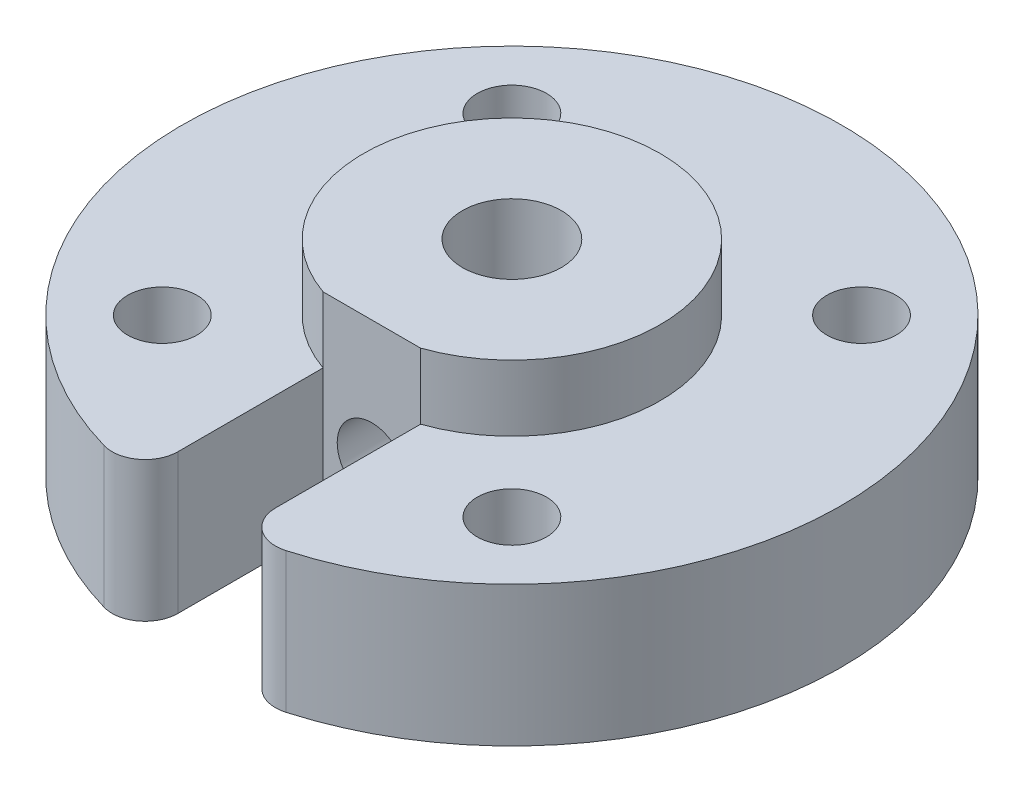
ISO-10303-21;
HEADER;
FILE_DESCRIPTION(('STEP AP214'),'2;1');
FILE_NAME('part.step','',(''),(''),'','','');
FILE_SCHEMA(('AUTOMOTIVE_DESIGN { 1 0 10303 214 1 1 1 1 }'));
ENDSEC;
DATA;
#1=APPLICATION_CONTEXT('core data for automotive mechanical design processes');
#2=APPLICATION_PROTOCOL_DEFINITION('international standard','automotive_design',2000,#1);
#3=PRODUCT_CONTEXT('',#1,'mechanical');
#4=PRODUCT('Part','Part','',(#3));
#5=PRODUCT_RELATED_PRODUCT_CATEGORY('part','',(#4));
#6=PRODUCT_DEFINITION_FORMATION('','',#4);
#7=PRODUCT_DEFINITION_CONTEXT('part definition',#1,'design');
#8=PRODUCT_DEFINITION('design','',#6,#7);
#9=PRODUCT_DEFINITION_SHAPE('','',#8);
#10=(LENGTH_UNIT() NAMED_UNIT(*) SI_UNIT(.MILLI.,.METRE.));
#11=(NAMED_UNIT(*) PLANE_ANGLE_UNIT() SI_UNIT($,.RADIAN.));
#12=(NAMED_UNIT(*) SI_UNIT($,.STERADIAN.) SOLID_ANGLE_UNIT());
#13=UNCERTAINTY_MEASURE_WITH_UNIT(LENGTH_MEASURE(1.E-05),#10,'distance_accuracy_value','');
#14=(GEOMETRIC_REPRESENTATION_CONTEXT(3) GLOBAL_UNCERTAINTY_ASSIGNED_CONTEXT((#13)) GLOBAL_UNIT_ASSIGNED_CONTEXT((#10,
#11,#12)) REPRESENTATION_CONTEXT('',''));
#15=CARTESIAN_POINT('',(0.,0.,0.));
#16=DIRECTION('',(0.,0.,1.));
#17=DIRECTION('',(1.,0.,0.));
#18=AXIS2_PLACEMENT_3D('',#15,#16,#17);
#19=CARTESIAN_POINT('',(0.,12.5,0.));
#20=DIRECTION('',(0.,-1.,0.));
#21=DIRECTION('',(0.,0.,-1.));
#22=AXIS2_PLACEMENT_3D('',#19,#20,#21);
#23=CYLINDRICAL_SURFACE('',#22,9.);
#24=CARTESIAN_POINT('',(0.,8.5,0.));
#25=DIRECTION('',(0.,-1.,0.));
#26=DIRECTION('',(0.,0.,-1.));
#27=AXIS2_PLACEMENT_3D('',#24,#25,#26);
#28=CIRCLE('',#27,9.);
#29=CARTESIAN_POINT('',(-2.95803989154981,8.5,8.5));
#30=VERTEX_POINT('',#29);
#31=CARTESIAN_POINT('',(2.95803989154981,8.5,8.5));
#32=VERTEX_POINT('',#31);
#33=EDGE_CURVE('E106',#30,#32,#28,.T.);
#34=ORIENTED_EDGE('',*,*,#33,.F.);
#35=DIRECTION('',(0.,-1.,0.));
#36=VECTOR('',#35,1.);
#37=CARTESIAN_POINT('',(-2.95803989154981,12.5,8.5));
#38=LINE('',#37,#36);
#39=CARTESIAN_POINT('',(-2.95803989154981,12.5,8.5));
#40=VERTEX_POINT('',#39);
#41=EDGE_CURVE('E119',#40,#30,#38,.T.);
#42=ORIENTED_EDGE('',*,*,#41,.F.);
#43=CARTESIAN_POINT('',(0.,12.5,0.));
#44=DIRECTION('',(0.,1.,0.));
#45=DIRECTION('',(0.,0.,1.));
#46=AXIS2_PLACEMENT_3D('',#43,#44,#45);
#47=CIRCLE('',#46,9.);
#48=CARTESIAN_POINT('',(2.95803989154981,12.5,8.5));
#49=VERTEX_POINT('',#48);
#50=EDGE_CURVE('E241',#49,#40,#47,.T.);
#51=ORIENTED_EDGE('',*,*,#50,.F.);
#52=DIRECTION('',(0.,-1.,0.));
#53=VECTOR('',#52,1.);
#54=CARTESIAN_POINT('',(2.95803989154981,12.5,8.5));
#55=LINE('',#54,#53);
#56=EDGE_CURVE('E121',#32,#49,#55,.F.);
#57=ORIENTED_EDGE('',*,*,#56,.F.);
#58=EDGE_LOOP('',(#34,#42,#51,#57));
#59=FACE_BOUND('',#58,.T.);
#60=ADVANCED_FACE('F32',(#59),#23,.T.);
#61=CARTESIAN_POINT('',(0.,12.5,0.));
#62=DIRECTION('',(0.,1.,0.));
#63=DIRECTION('',(0.,0.,1.));
#64=AXIS2_PLACEMENT_3D('',#61,#62,#63);
#65=PLANE('',#64);
#66=CARTESIAN_POINT('',(0.,12.5,0.));
#67=DIRECTION('',(0.,1.,0.));
#68=DIRECTION('',(0.,0.,1.));
#69=AXIS2_PLACEMENT_3D('',#66,#67,#68);
#70=CIRCLE('',#69,3.);
#71=CARTESIAN_POINT('',(0.,12.5,3.));
#72=VERTEX_POINT('',#71);
#73=EDGE_CURVE('E142',#72,#72,#70,.T.);
#74=ORIENTED_EDGE('',*,*,#73,.F.);
#75=EDGE_LOOP('',(#74));
#76=FACE_BOUND('',#75,.T.);
#77=ORIENTED_EDGE('',*,*,#50,.T.);
#78=DIRECTION('',(-1.,0.,0.));
#79=VECTOR('',#78,1.);
#80=CARTESIAN_POINT('',(-9.,12.5,8.5));
#81=LINE('',#80,#79);
#82=EDGE_CURVE('E127',#49,#40,#81,.T.);
#83=ORIENTED_EDGE('',*,*,#82,.F.);
#84=EDGE_LOOP('',(#77,#83));
#85=FACE_BOUND('',#84,.T.);
#86=ADVANCED_FACE('F189',(#76,#85),#65,.T.);
#87=CARTESIAN_POINT('',(0.,0.,0.));
#88=DIRECTION('',(0.,1.,0.));
#89=DIRECTION('',(0.,0.,1.));
#90=AXIS2_PLACEMENT_3D('',#87,#88,#89);
#91=PLANE('',#90);
#92=CARTESIAN_POINT('',(10.6066017177981,0.,10.6066017177983));
#93=DIRECTION('',(0.,-1.,0.));
#94=DIRECTION('',(0.,0.,-1.));
#95=AXIS2_PLACEMENT_3D('',#92,#93,#94);
#96=CIRCLE('',#95,2.09999999999999);
#97=CARTESIAN_POINT('',(10.6066017177981,0.,8.50660171779832));
#98=VERTEX_POINT('',#97);
#99=EDGE_CURVE('E361',#98,#98,#96,.T.);
#100=ORIENTED_EDGE('',*,*,#99,.F.);
#101=EDGE_LOOP('',(#100));
#102=FACE_BOUND('',#101,.T.);
#103=CARTESIAN_POINT('',(10.6066017177983,0.,-10.6066017177982));
#104=DIRECTION('',(0.,-1.,0.));
#105=DIRECTION('',(0.,0.,-1.));
#106=AXIS2_PLACEMENT_3D('',#103,#104,#105);
#107=CIRCLE('',#106,2.09999999999999);
#108=CARTESIAN_POINT('',(10.6066017177983,0.,-12.7066017177981));
#109=VERTEX_POINT('',#108);
#110=EDGE_CURVE('E222',#109,#109,#107,.T.);
#111=ORIENTED_EDGE('',*,*,#110,.F.);
#112=EDGE_LOOP('',(#111));
#113=FACE_BOUND('',#112,.T.);
#114=CARTESIAN_POINT('',(-10.6066017177982,0.,-10.6066017177982));
#115=DIRECTION('',(0.,-1.,0.));
#116=DIRECTION('',(0.,0.,-1.));
#117=AXIS2_PLACEMENT_3D('',#114,#115,#116);
#118=CIRCLE('',#117,2.09999999999999);
#119=CARTESIAN_POINT('',(-10.6066017177982,0.,-12.7066017177982));
#120=VERTEX_POINT('',#119);
#121=EDGE_CURVE('E212',#120,#120,#118,.T.);
#122=ORIENTED_EDGE('',*,*,#121,.F.);
#123=EDGE_LOOP('',(#122));
#124=FACE_BOUND('',#123,.T.);
#125=CARTESIAN_POINT('',(-10.6066017177982,0.,10.6066017177982));
#126=DIRECTION('',(0.,-1.,0.));
#127=DIRECTION('',(0.,0.,-1.));
#128=AXIS2_PLACEMENT_3D('',#125,#126,#127);
#129=CIRCLE('',#128,2.09999999999999);
#130=CARTESIAN_POINT('',(-10.6066017177982,0.,8.50660171779824));
#131=VERTEX_POINT('',#130);
#132=EDGE_CURVE('E211',#131,#131,#129,.T.);
#133=ORIENTED_EDGE('',*,*,#132,.F.);
#134=EDGE_LOOP('',(#133));
#135=FACE_BOUND('',#134,.T.);
#136=CARTESIAN_POINT('',(0.,0.,0.));
#137=DIRECTION('',(0.,1.,0.));
#138=DIRECTION('',(0.,0.,1.));
#139=AXIS2_PLACEMENT_3D('',#136,#137,#138);
#140=CIRCLE('',#139,3.);
#141=CARTESIAN_POINT('',(0.,0.,3.));
#142=VERTEX_POINT('',#141);
#143=EDGE_CURVE('E132',#142,#142,#140,.T.);
#144=ORIENTED_EDGE('',*,*,#143,.T.);
#145=EDGE_LOOP('',(#144));
#146=FACE_BOUND('',#145,.T.);
#147=DIRECTION('',(0.,0.,1.));
#148=VECTOR('',#147,1.);
#149=CARTESIAN_POINT('',(-2.95803989154981,0.,0.));
#150=LINE('',#149,#148);
#151=CARTESIAN_POINT('',(-2.95803989154981,0.,8.5));
#152=VERTEX_POINT('',#151);
#153=CARTESIAN_POINT('',(-2.95803989154981,0.,17.3036944157541));
#154=VERTEX_POINT('',#153);
#155=EDGE_CURVE('E100',#152,#154,#150,.T.);
#156=ORIENTED_EDGE('',*,*,#155,.T.);
#157=CARTESIAN_POINT('',(-4.95803989154981,0.,17.3036944157541));
#158=DIRECTION('',(0.,1.,0.));
#159=DIRECTION('',(0.,0.,1.));
#160=AXIS2_PLACEMENT_3D('',#157,#158,#159);
#161=CIRCLE('',#160,2.);
#162=CARTESIAN_POINT('',(-5.50893321283312,0.,19.2263271286157));
#163=VERTEX_POINT('',#162);
#164=EDGE_CURVE('E245',#154,#163,#161,.F.);
#165=ORIENTED_EDGE('',*,*,#164,.T.);
#166=CARTESIAN_POINT('',(0.,0.,0.));
#167=DIRECTION('',(0.,-1.,0.));
#168=DIRECTION('',(0.,0.,-1.));
#169=AXIS2_PLACEMENT_3D('',#166,#167,#168);
#170=CIRCLE('',#169,20.);
#171=CARTESIAN_POINT('',(5.50893321283312,0.,19.2263271286157));
#172=VERTEX_POINT('',#171);
#173=EDGE_CURVE('E231',#163,#172,#170,.T.);
#174=ORIENTED_EDGE('',*,*,#173,.T.);
#175=CARTESIAN_POINT('',(4.95803989154981,0.,17.3036944157541));
#176=DIRECTION('',(0.,1.,0.));
#177=DIRECTION('',(0.,0.,1.));
#178=AXIS2_PLACEMENT_3D('',#175,#176,#177);
#179=CIRCLE('',#178,2.);
#180=CARTESIAN_POINT('',(2.95803989154981,0.,17.3036944157541));
#181=VERTEX_POINT('',#180);
#182=EDGE_CURVE('E243',#172,#181,#179,.F.);
#183=ORIENTED_EDGE('',*,*,#182,.T.);
#184=DIRECTION('',(0.,0.,1.));
#185=VECTOR('',#184,1.);
#186=CARTESIAN_POINT('',(2.95803989154981,0.,0.));
#187=LINE('',#186,#185);
#188=CARTESIAN_POINT('',(2.95803989154981,0.,8.5));
#189=VERTEX_POINT('',#188);
#190=EDGE_CURVE('E114',#189,#181,#187,.T.);
#191=ORIENTED_EDGE('',*,*,#190,.F.);
#192=DIRECTION('',(1.,0.,0.));
#193=VECTOR('',#192,1.);
#194=CARTESIAN_POINT('',(-9.,0.,8.5));
#195=LINE('',#194,#193);
#196=EDGE_CURVE('E105',#152,#189,#195,.T.);
#197=ORIENTED_EDGE('',*,*,#196,.F.);
#198=EDGE_LOOP('',(#156,#165,#174,#183,#191,#197));
#199=FACE_BOUND('',#198,.T.);
#200=ADVANCED_FACE('F151',(#102,#113,#124,#135,#146,#199),#91,.F.);
#201=CARTESIAN_POINT('',(0.,5.,0.));
#202=DIRECTION('',(0.,0.,-1.));
#203=DIRECTION('',(-1.,0.,0.));
#204=AXIS2_PLACEMENT_3D('',#201,#202,#203);
#205=CYLINDRICAL_SURFACE('',#204,2.09999999999999);
#206=CARTESIAN_POINT('',(-2.09999999999999,5.,2.14242852856286));
#207=CARTESIAN_POINT('',(-2.09999602164292,5.10080118209729,2.14243638279411));
#208=CARTESIAN_POINT('',(-2.09267425451302,5.20162452717755,2.14968361222003));
#209=CARTESIAN_POINT('',(-2.06408052690835,5.39953260475881,2.17713849427744));
#210=CARTESIAN_POINT('',(-2.04277754974695,5.49660851557017,2.19737496074823));
#211=CARTESIAN_POINT('',(-1.98804598401032,5.68341792331117,2.24699925671914));
#212=CARTESIAN_POINT('',(-1.95475351750639,5.77322050784831,2.27628384865));
#213=CARTESIAN_POINT('',(-1.87736165117184,5.94575981057751,2.34052168482312));
#214=CARTESIAN_POINT('',(-1.8332614987124,6.02849603613904,2.37547532379077));
#215=CARTESIAN_POINT('',(-1.72654345994894,6.20041737648515,2.4544212273099));
#216=CARTESIAN_POINT('',(-1.662035158771,6.28819447927997,2.49892440249038));
#217=CARTESIAN_POINT('',(-1.52013414958953,6.45293640179246,2.587704985701));
#218=CARTESIAN_POINT('',(-1.4427255794177,6.52988769258251,2.63198204575612));
#219=CARTESIAN_POINT('',(-1.26173250355452,6.68355880665101,2.72396309113984));
#220=CARTESIAN_POINT('',(-1.15593562828216,6.75810577880123,2.77100974068981));
#221=CARTESIAN_POINT('',(-0.929408573839365,6.88762321662011,2.85494261250272));
#222=CARTESIAN_POINT('',(-0.808708920961216,6.9426328339596,2.89184912098326));
#223=CARTESIAN_POINT('',(-0.589969945445677,7.01779365037674,2.94295124645066));
#224=CARTESIAN_POINT('',(-0.494574305038632,7.04334187965745,2.96058586289675));
#225=CARTESIAN_POINT('',(-0.299930223787055,7.08082622928552,2.98657838567664));
#226=CARTESIAN_POINT('',(-0.200684924844653,7.09277321825467,2.99494369887954));
#227=CARTESIAN_POINT('',(-0.000967143719217699,7.10238309420734,3.00166671758024));
#228=CARTESIAN_POINT('',(0.0995073448428462,7.10001823930856,3.00000498681155));
#229=CARTESIAN_POINT('',(0.298450041145124,7.08108567256871,2.98678296023488));
#230=CARTESIAN_POINT('',(0.396917681574402,7.06451400012189,2.97521990411617));
#231=CARTESIAN_POINT('',(0.586910014758709,7.01863278518998,2.9435711394848));
#232=CARTESIAN_POINT('',(0.678541865368291,6.98962253437549,2.92368592848238));
#233=CARTESIAN_POINT('',(0.855439349247827,6.92022421928718,2.876909009763));
#234=CARTESIAN_POINT('',(0.94070372770602,6.87983391983934,2.85001592569624));
#235=CARTESIAN_POINT('',(1.11283793862578,6.78391787390425,2.78763084510121));
#236=CARTESIAN_POINT('',(1.19881384252342,6.72720216151528,2.75151250378176));
#237=CARTESIAN_POINT('',(1.3605619568758,6.6029022739928,2.67523565239691));
#238=CARTESIAN_POINT('',(1.43632301459622,6.53530639349694,2.63507280869808));
#239=CARTESIAN_POINT('',(1.58960261822575,6.37744204340209,2.54604490567428));
#240=CARTESIAN_POINT('',(1.6650186720166,6.28528040590573,2.4969066890714));
#241=CARTESIAN_POINT('',(1.79983510095355,6.08849050444879,2.4015408545929));
#242=CARTESIAN_POINT('',(1.85923961448999,5.98386547191466,2.35531248700121));
#243=CARTESIAN_POINT('',(1.94855264825869,5.78856688904025,2.28159802338743));
#244=CARTESIAN_POINT('',(1.98210609109211,5.70027451459743,2.25225087153781));
#245=CARTESIAN_POINT('',(2.03740031989551,5.51774367585138,2.20236114038834));
#246=CARTESIAN_POINT('',(2.05916319745107,5.42351670353727,2.18180211044459));
#247=CARTESIAN_POINT('',(2.08967380066583,5.2300519695135,2.15261274855802));
#248=CARTESIAN_POINT('',(2.09828747378878,5.13077312336374,2.14410534183547));
#249=CARTESIAN_POINT('',(2.10124630568855,4.93180517128583,2.1412086525496));
#250=CARTESIAN_POINT('',(2.09559666625961,4.83211622815748,2.14681422301691));
#251=CARTESIAN_POINT('',(2.07235487849599,4.64985117172861,2.16922512584482));
#252=CARTESIAN_POINT('',(2.05653171310714,4.56682232202212,2.18436555835549));
#253=CARTESIAN_POINT('',(2.01563399534999,4.40484579540583,2.22215988293773));
#254=CARTESIAN_POINT('',(1.99054968944477,4.32590252159592,2.2448216937327));
#255=CARTESIAN_POINT('',(1.91823476055615,4.13692441784006,2.30728989885128));
#256=CARTESIAN_POINT('',(1.86613806390326,4.02976164702858,2.35014375000237));
#257=CARTESIAN_POINT('',(1.74591178220926,3.82708739035201,2.4407951945331));
#258=CARTESIAN_POINT('',(1.6777508602086,3.73159923858623,2.48860234700189));
#259=CARTESIAN_POINT('',(1.52511012344374,3.55147493505045,2.58502403499954));
#260=CARTESIAN_POINT('',(1.44034661461233,3.46707759013433,2.63363678085937));
#261=CARTESIAN_POINT('',(1.25629615404688,3.31296621822138,2.7262249578188));
#262=CARTESIAN_POINT('',(1.15703086572032,3.24323066134107,2.77020714050646));
#263=CARTESIAN_POINT('',(0.962367573398686,3.13067771591488,2.8430343218421));
#264=CARTESIAN_POINT('',(0.86892219450313,3.08533376830131,2.87317642109174));
#265=CARTESIAN_POINT('',(0.67427987800868,3.00844972618793,2.92497219655113));
#266=CARTESIAN_POINT('',(0.57308768639025,2.97690125834809,2.94663102095635));
#267=CARTESIAN_POINT('',(0.364831618377038,2.92916327226326,2.97960788705012));
#268=CARTESIAN_POINT('',(0.257737513076732,2.91306248511563,2.99086617475908));
#269=CARTESIAN_POINT('',(0.0417666466583772,2.89763002199153,3.00165393558886));
#270=CARTESIAN_POINT('',(-0.0671094025392402,2.89829180495813,3.00118798371971));
#271=CARTESIAN_POINT('',(-0.272289777850561,2.91543139108219,2.98921365831379));
#272=CARTESIAN_POINT('',(-0.368792300103633,2.93037472244342,2.9787766580816));
#273=CARTESIAN_POINT('',(-0.55753485149346,2.97305134194407,2.94928525203853));
#274=CARTESIAN_POINT('',(-0.649774066084623,3.00078706316898,2.93022920691689));
#275=CARTESIAN_POINT('',(-0.831156056304383,3.0689638806384,2.88413721441091));
#276=CARTESIAN_POINT('',(-0.920077354039739,3.10981581210055,2.85684523794218));
#277=CARTESIAN_POINT('',(-1.08988850197529,3.20236135292384,2.79647566783174));
#278=CARTESIAN_POINT('',(-1.17077679413152,3.25405705946491,2.76339695524428));
#279=CARTESIAN_POINT('',(-1.33572629525633,3.37582944705394,2.68798939205913));
#280=CARTESIAN_POINT('',(-1.41830558709393,3.44751634153187,2.64502293494774));
#281=CARTESIAN_POINT('',(-1.57109978754637,3.60232169916417,2.55723192062595));
#282=CARTESIAN_POINT('',(-1.64128827461709,3.6854639331693,2.51240363872625));
#283=CARTESIAN_POINT('',(-1.77845654272628,3.87616640660146,2.4176556414013));
#284=CARTESIAN_POINT('',(-1.84319523687473,3.98551040900359,2.36804412270408));
#285=CARTESIAN_POINT('',(-1.9528530982932,4.21726460710126,2.27846176062126));
#286=CARTESIAN_POINT('',(-1.99783234726931,4.33963376800504,2.23846186201535));
#287=CARTESIAN_POINT('',(-2.05371335315947,4.55271837047893,2.18705372583927));
#288=CARTESIAN_POINT('',(-2.07096487029758,4.6405261896245,2.17056502262194));
#289=CARTESIAN_POINT('',(-2.09410004221784,4.81888676393192,2.14825822428074));
#290=CARTESIAN_POINT('',(-2.10000357438415,4.90943443670217,2.14242147187104));
#291=CARTESIAN_POINT('',(-2.09999999999999,5.,2.14242852856286));
#292=B_SPLINE_CURVE_WITH_KNOTS('',3,(#206,#207,#208,#209,#210,#211,#212,#213,#214,#215,#216,
#217,#218,#219,#220,#221,#222,#223,#224,#225,#226,#227,#228,#229,#230,#231,#232,#233,#234,#235,
#236,#237,#238,#239,#240,#241,#242,#243,#244,#245,#246,#247,#248,#249,#250,#251,#252,#253,#254,
#255,#256,#257,#258,#259,#260,#261,#262,#263,#264,#265,#266,#267,#268,#269,#270,#271,#272,#273,
#274,#275,#276,#277,#278,#279,#280,#281,#282,#283,#284,#285,#286,#287,#288,#289,#290,#291),
.UNSPECIFIED.,.T.,.F.,(4,2,2,2,2,2,2,2,2,2,2,2,2,2,2,2,2,2,2,2,2,2,2,2,2,2,2,2,2,2,2,2,2,2,2,2,
2,2,2,2,2,2,4),(0.,0.301973223435531,0.604618635711374,0.903931039140894,1.20326429210161,
1.55501769378841,1.90720684651704,2.31804977810942,2.7280646973405,3.02773360434288,
3.32716288032115,3.62717275157127,3.92726628739668,4.22051205037771,4.51381545043927,
4.84003888345371,5.16661565707934,5.55151589746291,5.9363165597808,6.23199289437156,
6.52711329718777,6.82522273911173,7.12322347697782,7.37980613638278,7.63665979487588,
8.01451127327344,8.39310602933112,8.77884561454897,9.16401474783142,9.48714146722313,
9.81007178763059,10.134846099452,10.4594936804374,10.7527707598947,11.0461036430495,
11.3497065387119,11.6533682052277,12.0045164637744,12.3564046795999,12.7636402272856,
13.1696287925793,13.4414153585327,13.7127254216916),.UNSPECIFIED.);
#293=CARTESIAN_POINT('',(-2.09999999999999,5.,2.14242852856286));
#294=VERTEX_POINT('',#293);
#295=EDGE_CURVE('E128',#294,#294,#292,.T.);
#296=ORIENTED_EDGE('',*,*,#295,.T.);
#297=EDGE_LOOP('',(#296));
#298=FACE_BOUND('',#297,.T.);
#299=CARTESIAN_POINT('',(0.,5.,8.5));
#300=DIRECTION('',(0.,0.,1.));
#301=DIRECTION('',(1.,0.,0.));
#302=AXIS2_PLACEMENT_3D('',#299,#300,#301);
#303=CIRCLE('',#302,2.09999999999999);
#304=CARTESIAN_POINT('',(2.09999999999999,5.,8.5));
#305=VERTEX_POINT('',#304);
#306=EDGE_CURVE('E235',#305,#305,#303,.F.);
#307=ORIENTED_EDGE('',*,*,#306,.F.);
#308=EDGE_LOOP('',(#307));
#309=FACE_BOUND('',#308,.T.);
#310=ADVANCED_FACE('F147',(#298,#309),#205,.F.);
#311=CARTESIAN_POINT('',(0.,12.5,0.));
#312=DIRECTION('',(0.,-1.,0.));
#313=DIRECTION('',(0.,0.,-1.));
#314=AXIS2_PLACEMENT_3D('',#311,#312,#313);
#315=CYLINDRICAL_SURFACE('',#314,3.);
#316=ORIENTED_EDGE('',*,*,#295,.F.);
#317=EDGE_LOOP('',(#316));
#318=FACE_BOUND('',#317,.T.);
#319=ORIENTED_EDGE('',*,*,#73,.T.);
#320=EDGE_LOOP('',(#319));
#321=FACE_BOUND('',#320,.T.);
#322=ORIENTED_EDGE('',*,*,#143,.F.);
#323=EDGE_LOOP('',(#322));
#324=FACE_BOUND('',#323,.T.);
#325=ADVANCED_FACE('F144',(#318,#321,#324),#315,.F.);
#326=CARTESIAN_POINT('',(0.,0.,8.5));
#327=DIRECTION('',(0.,0.,1.));
#328=DIRECTION('',(1.,0.,0.));
#329=AXIS2_PLACEMENT_3D('',#326,#327,#328);
#330=PLANE('',#329);
#331=ORIENTED_EDGE('',*,*,#306,.T.);
#332=EDGE_LOOP('',(#331));
#333=FACE_BOUND('',#332,.T.);
#334=ORIENTED_EDGE('',*,*,#41,.T.);
#335=DIRECTION('',(0.,-1.,0.));
#336=VECTOR('',#335,1.);
#337=CARTESIAN_POINT('',(-2.95803989154981,8.5,8.5));
#338=LINE('',#337,#336);
#339=EDGE_CURVE('E93',#30,#152,#338,.T.);
#340=ORIENTED_EDGE('',*,*,#339,.T.);
#341=ORIENTED_EDGE('',*,*,#196,.T.);
#342=EDGE_CURVE('E129',#189,#32,#55,.F.);
#343=ORIENTED_EDGE('',*,*,#342,.T.);
#344=ORIENTED_EDGE('',*,*,#56,.T.);
#345=ORIENTED_EDGE('',*,*,#82,.T.);
#346=EDGE_LOOP('',(#334,#340,#341,#343,#344,#345));
#347=FACE_BOUND('',#346,.T.);
#348=ADVANCED_FACE('F125',(#333,#347),#330,.T.);
#349=CARTESIAN_POINT('',(-2.95803989154981,8.5,0.));
#350=DIRECTION('',(1.,0.,0.));
#351=DIRECTION('',(0.,0.,-1.));
#352=AXIS2_PLACEMENT_3D('',#349,#350,#351);
#353=PLANE('',#352);
#354=DIRECTION('',(0.,0.,1.));
#355=VECTOR('',#354,1.);
#356=CARTESIAN_POINT('',(-2.95803989154981,8.5,0.));
#357=LINE('',#356,#355);
#358=CARTESIAN_POINT('',(-2.95803989154981,8.5,17.3036944157541));
#359=VERTEX_POINT('',#358);
#360=EDGE_CURVE('E97',#30,#359,#357,.T.);
#361=ORIENTED_EDGE('',*,*,#360,.T.);
#362=DIRECTION('',(0.,-1.,0.));
#363=VECTOR('',#362,1.);
#364=CARTESIAN_POINT('',(-2.95803989154981,8.5,17.3036944157541));
#365=LINE('',#364,#363);
#366=EDGE_CURVE('E205',#359,#154,#365,.T.);
#367=ORIENTED_EDGE('',*,*,#366,.T.);
#368=ORIENTED_EDGE('',*,*,#155,.F.);
#369=ORIENTED_EDGE('',*,*,#339,.F.);
#370=EDGE_LOOP('',(#361,#367,#368,#369));
#371=FACE_BOUND('',#370,.T.);
#372=ADVANCED_FACE('F95',(#371),#353,.T.);
#373=CARTESIAN_POINT('',(2.95803989154981,8.5,0.));
#374=DIRECTION('',(1.,0.,0.));
#375=DIRECTION('',(0.,0.,-1.));
#376=AXIS2_PLACEMENT_3D('',#373,#374,#375);
#377=PLANE('',#376);
#378=ORIENTED_EDGE('',*,*,#190,.T.);
#379=DIRECTION('',(0.,1.,0.));
#380=VECTOR('',#379,1.);
#381=CARTESIAN_POINT('',(2.95803989154981,8.5,17.3036944157541));
#382=LINE('',#381,#380);
#383=CARTESIAN_POINT('',(2.95803989154981,8.5,17.3036944157541));
#384=VERTEX_POINT('',#383);
#385=EDGE_CURVE('E11',#181,#384,#382,.T.);
#386=ORIENTED_EDGE('',*,*,#385,.T.);
#387=DIRECTION('',(0.,0.,1.));
#388=VECTOR('',#387,1.);
#389=CARTESIAN_POINT('',(2.95803989154981,8.5,0.));
#390=LINE('',#389,#388);
#391=EDGE_CURVE('E123',#32,#384,#390,.T.);
#392=ORIENTED_EDGE('',*,*,#391,.F.);
#393=ORIENTED_EDGE('',*,*,#342,.F.);
#394=EDGE_LOOP('',(#378,#386,#392,#393));
#395=FACE_BOUND('',#394,.T.);
#396=ADVANCED_FACE('F158',(#395),#377,.F.);
#397=CARTESIAN_POINT('',(0.,8.5,0.));
#398=DIRECTION('',(0.,-1.,0.));
#399=DIRECTION('',(0.,0.,-1.));
#400=AXIS2_PLACEMENT_3D('',#397,#398,#399);
#401=CYLINDRICAL_SURFACE('',#400,20.);
#402=ORIENTED_EDGE('',*,*,#173,.F.);
#403=DIRECTION('',(0.,-1.,0.));
#404=VECTOR('',#403,1.);
#405=CARTESIAN_POINT('',(-5.50893321283312,8.5,19.2263271286157));
#406=LINE('',#405,#404);
#407=CARTESIAN_POINT('',(-5.50893321283312,8.5,19.2263271286157));
#408=VERTEX_POINT('',#407);
#409=EDGE_CURVE('E204',#163,#408,#406,.F.);
#410=ORIENTED_EDGE('',*,*,#409,.T.);
#411=CARTESIAN_POINT('',(0.,8.5,0.));
#412=DIRECTION('',(0.,-1.,0.));
#413=DIRECTION('',(0.,0.,-1.));
#414=AXIS2_PLACEMENT_3D('',#411,#412,#413);
#415=CIRCLE('',#414,20.);
#416=CARTESIAN_POINT('',(5.50893321283312,8.5,19.2263271286157));
#417=VERTEX_POINT('',#416);
#418=EDGE_CURVE('E113',#408,#417,#415,.T.);
#419=ORIENTED_EDGE('',*,*,#418,.T.);
#420=DIRECTION('',(0.,-1.,0.));
#421=VECTOR('',#420,1.);
#422=CARTESIAN_POINT('',(5.50893321283312,8.5,19.2263271286157));
#423=LINE('',#422,#421);
#424=EDGE_CURVE('E247',#417,#172,#423,.T.);
#425=ORIENTED_EDGE('',*,*,#424,.T.);
#426=EDGE_LOOP('',(#402,#410,#419,#425));
#427=FACE_BOUND('',#426,.T.);
#428=ADVANCED_FACE('F159',(#427),#401,.T.);
#429=CARTESIAN_POINT('',(0.,8.5,0.));
#430=DIRECTION('',(0.,-1.,0.));
#431=DIRECTION('',(0.,0.,-1.));
#432=AXIS2_PLACEMENT_3D('',#429,#430,#431);
#433=PLANE('',#432);
#434=CARTESIAN_POINT('',(10.6066017177981,8.5,10.6066017177983));
#435=DIRECTION('',(0.,-1.,0.));
#436=DIRECTION('',(0.,0.,-1.));
#437=AXIS2_PLACEMENT_3D('',#434,#435,#436);
#438=CIRCLE('',#437,2.09999999999999);
#439=CARTESIAN_POINT('',(10.6066017177981,8.5,8.50660171779831));
#440=VERTEX_POINT('',#439);
#441=EDGE_CURVE('E370',#440,#440,#438,.T.);
#442=ORIENTED_EDGE('',*,*,#441,.T.);
#443=EDGE_LOOP('',(#442));
#444=FACE_BOUND('',#443,.T.);
#445=CARTESIAN_POINT('',(10.6066017177983,8.5,-10.6066017177982));
#446=DIRECTION('',(0.,-1.,0.));
#447=DIRECTION('',(0.,0.,-1.));
#448=AXIS2_PLACEMENT_3D('',#445,#446,#447);
#449=CIRCLE('',#448,2.09999999999999);
#450=CARTESIAN_POINT('',(10.6066017177983,8.5,-12.7066017177981));
#451=VERTEX_POINT('',#450);
#452=EDGE_CURVE('E36',#451,#451,#449,.T.);
#453=ORIENTED_EDGE('',*,*,#452,.T.);
#454=EDGE_LOOP('',(#453));
#455=FACE_BOUND('',#454,.T.);
#456=CARTESIAN_POINT('',(-10.6066017177982,8.5,-10.6066017177982));
#457=DIRECTION('',(0.,-1.,0.));
#458=DIRECTION('',(0.,0.,-1.));
#459=AXIS2_PLACEMENT_3D('',#456,#457,#458);
#460=CIRCLE('',#459,2.09999999999999);
#461=CARTESIAN_POINT('',(-10.6066017177982,8.5,-12.7066017177982));
#462=VERTEX_POINT('',#461);
#463=EDGE_CURVE('E209',#462,#462,#460,.T.);
#464=ORIENTED_EDGE('',*,*,#463,.T.);
#465=EDGE_LOOP('',(#464));
#466=FACE_BOUND('',#465,.T.);
#467=CARTESIAN_POINT('',(-10.6066017177982,8.5,10.6066017177982));
#468=DIRECTION('',(0.,-1.,0.));
#469=DIRECTION('',(0.,0.,-1.));
#470=AXIS2_PLACEMENT_3D('',#467,#468,#469);
#471=CIRCLE('',#470,2.09999999999999);
#472=CARTESIAN_POINT('',(-10.6066017177982,8.5,8.50660171779824));
#473=VERTEX_POINT('',#472);
#474=EDGE_CURVE('E216',#473,#473,#471,.T.);
#475=ORIENTED_EDGE('',*,*,#474,.T.);
#476=EDGE_LOOP('',(#475));
#477=FACE_BOUND('',#476,.T.);
#478=ORIENTED_EDGE('',*,*,#418,.F.);
#479=CARTESIAN_POINT('',(-4.95803989154981,8.5,17.3036944157541));
#480=DIRECTION('',(0.,-1.,0.));
#481=DIRECTION('',(0.,0.,-1.));
#482=AXIS2_PLACEMENT_3D('',#479,#480,#481);
#483=CIRCLE('',#482,2.);
#484=EDGE_CURVE('E41',#408,#359,#483,.F.);
#485=ORIENTED_EDGE('',*,*,#484,.T.);
#486=ORIENTED_EDGE('',*,*,#360,.F.);
#487=ORIENTED_EDGE('',*,*,#33,.T.);
#488=ORIENTED_EDGE('',*,*,#391,.T.);
#489=CARTESIAN_POINT('',(4.95803989154981,8.5,17.3036944157541));
#490=DIRECTION('',(0.,-1.,0.));
#491=DIRECTION('',(0.,0.,-1.));
#492=AXIS2_PLACEMENT_3D('',#489,#490,#491);
#493=CIRCLE('',#492,2.);
#494=EDGE_CURVE('E54',#384,#417,#493,.F.);
#495=ORIENTED_EDGE('',*,*,#494,.T.);
#496=EDGE_LOOP('',(#478,#485,#486,#487,#488,#495));
#497=FACE_BOUND('',#496,.T.);
#498=ADVANCED_FACE('F110',(#444,#455,#466,#477,#497),#433,.F.);
#499=CARTESIAN_POINT('',(-4.95803989154981,8.5,17.3036944157541));
#500=DIRECTION('',(0.,-1.,0.));
#501=DIRECTION('',(0.,0.,-1.));
#502=AXIS2_PLACEMENT_3D('',#499,#500,#501);
#503=CYLINDRICAL_SURFACE('',#502,2.);
#504=ORIENTED_EDGE('',*,*,#484,.F.);
#505=ORIENTED_EDGE('',*,*,#409,.F.);
#506=ORIENTED_EDGE('',*,*,#164,.F.);
#507=ORIENTED_EDGE('',*,*,#366,.F.);
#508=EDGE_LOOP('',(#504,#505,#506,#507));
#509=FACE_BOUND('',#508,.T.);
#510=ADVANCED_FACE('F167',(#509),#503,.T.);
#511=CARTESIAN_POINT('',(4.95803989154981,8.5,17.3036944157541));
#512=DIRECTION('',(0.,-1.,0.));
#513=DIRECTION('',(0.,0.,-1.));
#514=AXIS2_PLACEMENT_3D('',#511,#512,#513);
#515=CYLINDRICAL_SURFACE('',#514,2.);
#516=ORIENTED_EDGE('',*,*,#494,.F.);
#517=ORIENTED_EDGE('',*,*,#385,.F.);
#518=ORIENTED_EDGE('',*,*,#182,.F.);
#519=ORIENTED_EDGE('',*,*,#424,.F.);
#520=EDGE_LOOP('',(#516,#517,#518,#519));
#521=FACE_BOUND('',#520,.T.);
#522=ADVANCED_FACE('F34',(#521),#515,.T.);
#523=CARTESIAN_POINT('',(-10.6066017177982,0.,10.6066017177982));
#524=DIRECTION('',(0.,-1.,0.));
#525=DIRECTION('',(0.,0.,-1.));
#526=AXIS2_PLACEMENT_3D('',#523,#524,#525);
#527=CYLINDRICAL_SURFACE('',#526,2.09999999999999);
#528=ORIENTED_EDGE('',*,*,#132,.T.);
#529=EDGE_LOOP('',(#528));
#530=FACE_BOUND('',#529,.T.);
#531=ORIENTED_EDGE('',*,*,#474,.F.);
#532=EDGE_LOOP('',(#531));
#533=FACE_BOUND('',#532,.T.);
#534=ADVANCED_FACE('F169',(#530,#533),#527,.F.);
#535=CARTESIAN_POINT('',(-10.6066017177982,0.,-10.6066017177982));
#536=DIRECTION('',(0.,-1.,0.));
#537=DIRECTION('',(0.,0.,-1.));
#538=AXIS2_PLACEMENT_3D('',#535,#536,#537);
#539=CYLINDRICAL_SURFACE('',#538,2.09999999999999);
#540=ORIENTED_EDGE('',*,*,#121,.T.);
#541=EDGE_LOOP('',(#540));
#542=FACE_BOUND('',#541,.T.);
#543=ORIENTED_EDGE('',*,*,#463,.F.);
#544=EDGE_LOOP('',(#543));
#545=FACE_BOUND('',#544,.T.);
#546=ADVANCED_FACE('F172',(#542,#545),#539,.F.);
#547=CARTESIAN_POINT('',(10.6066017177983,0.,-10.6066017177982));
#548=DIRECTION('',(0.,-1.,0.));
#549=DIRECTION('',(0.,0.,-1.));
#550=AXIS2_PLACEMENT_3D('',#547,#548,#549);
#551=CYLINDRICAL_SURFACE('',#550,2.09999999999999);
#552=ORIENTED_EDGE('',*,*,#110,.T.);
#553=EDGE_LOOP('',(#552));
#554=FACE_BOUND('',#553,.T.);
#555=ORIENTED_EDGE('',*,*,#452,.F.);
#556=EDGE_LOOP('',(#555));
#557=FACE_BOUND('',#556,.T.);
#558=ADVANCED_FACE('F176',(#554,#557),#551,.F.);
#559=CARTESIAN_POINT('',(10.6066017177981,0.,10.6066017177983));
#560=DIRECTION('',(0.,-1.,0.));
#561=DIRECTION('',(0.,0.,-1.));
#562=AXIS2_PLACEMENT_3D('',#559,#560,#561);
#563=CYLINDRICAL_SURFACE('',#562,2.09999999999999);
#564=ORIENTED_EDGE('',*,*,#99,.T.);
#565=EDGE_LOOP('',(#564));
#566=FACE_BOUND('',#565,.T.);
#567=ORIENTED_EDGE('',*,*,#441,.F.);
#568=EDGE_LOOP('',(#567));
#569=FACE_BOUND('',#568,.T.);
#570=ADVANCED_FACE('F180',(#566,#569),#563,.F.);
#571=CLOSED_SHELL('',(#60,#86,#200,#310,#325,#348,#372,#396,#428,#498,#510,#522,#534,#546,#558,#570));
#572=MANIFOLD_SOLID_BREP('B2',#571);
#573=ADVANCED_BREP_SHAPE_REPRESENTATION('',(#18,#572),#14);
#574=SHAPE_DEFINITION_REPRESENTATION(#9,#573);
ENDSEC;
END-ISO-10303-21;
